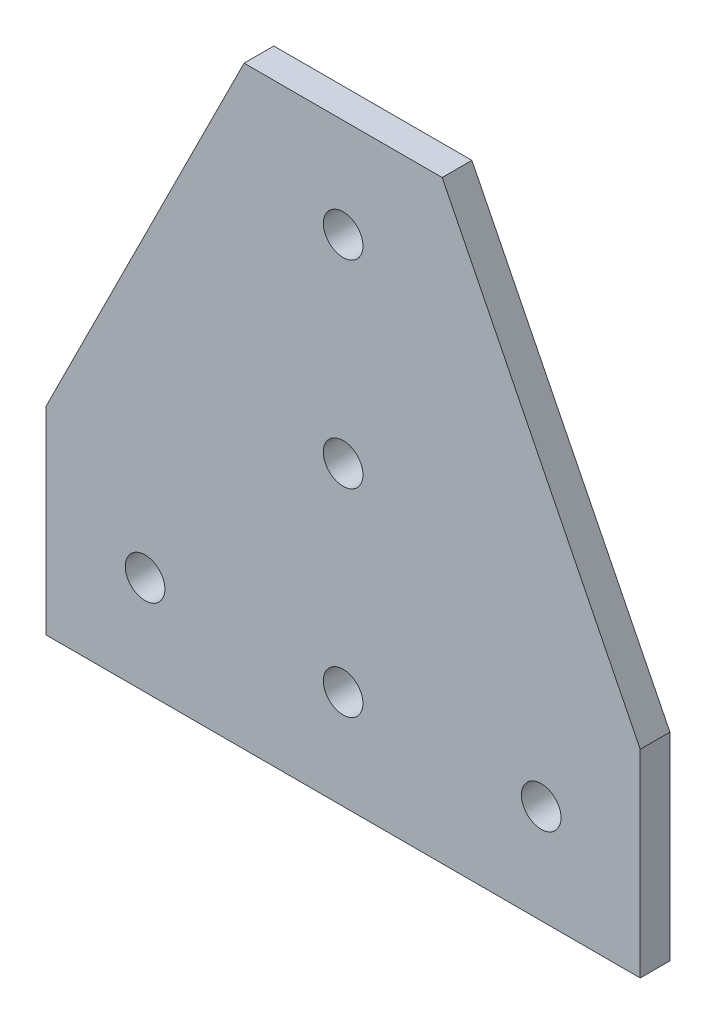
ISO-10303-21;
HEADER;
FILE_DESCRIPTION(('STEP AP214'),'2;1');
FILE_NAME('part.step','',(''),(''),'','','');
FILE_SCHEMA(('AUTOMOTIVE_DESIGN { 1 0 10303 214 1 1 1 1 }'));
ENDSEC;
DATA;
#1=APPLICATION_CONTEXT('core data for automotive mechanical design processes');
#2=APPLICATION_PROTOCOL_DEFINITION('international standard','automotive_design',2000,#1);
#3=PRODUCT_CONTEXT('',#1,'mechanical');
#4=PRODUCT('Part','Part','',(#3));
#5=PRODUCT_RELATED_PRODUCT_CATEGORY('part','',(#4));
#6=PRODUCT_DEFINITION_FORMATION('','',#4);
#7=PRODUCT_DEFINITION_CONTEXT('part definition',#1,'design');
#8=PRODUCT_DEFINITION('design','',#6,#7);
#9=PRODUCT_DEFINITION_SHAPE('','',#8);
#10=(LENGTH_UNIT() NAMED_UNIT(*) SI_UNIT(.MILLI.,.METRE.));
#11=(NAMED_UNIT(*) PLANE_ANGLE_UNIT() SI_UNIT($,.RADIAN.));
#12=(NAMED_UNIT(*) SI_UNIT($,.STERADIAN.) SOLID_ANGLE_UNIT());
#13=UNCERTAINTY_MEASURE_WITH_UNIT(LENGTH_MEASURE(1.E-05),#10,'distance_accuracy_value','');
#14=(GEOMETRIC_REPRESENTATION_CONTEXT(3) GLOBAL_UNCERTAINTY_ASSIGNED_CONTEXT((#13)) GLOBAL_UNIT_ASSIGNED_CONTEXT((#10,
#11,#12)) REPRESENTATION_CONTEXT('',''));
#15=CARTESIAN_POINT('',(0.,0.,0.));
#16=DIRECTION('',(0.,0.,1.));
#17=DIRECTION('',(1.,0.,0.));
#18=AXIS2_PLACEMENT_3D('',#15,#16,#17);
#19=CARTESIAN_POINT('',(0.,0.,3.));
#20=DIRECTION('',(0.,0.,1.));
#21=DIRECTION('',(1.,0.,0.));
#22=AXIS2_PLACEMENT_3D('',#19,#20,#21);
#23=PLANE('',#22);
#24=CARTESIAN_POINT('',(-34.3557518002468,-10.7418807523334,3.));
#25=DIRECTION('',(0.,0.,1.));
#26=DIRECTION('',(1.,0.,0.));
#27=AXIS2_PLACEMENT_3D('',#24,#25,#26);
#28=CIRCLE('',#27,2.00000000000002);
#29=CARTESIAN_POINT('',(-32.3557518002467,-10.7418807523334,3.));
#30=VERTEX_POINT('',#29);
#31=EDGE_CURVE('E222',#30,#30,#28,.T.);
#32=ORIENTED_EDGE('',*,*,#31,.F.);
#33=EDGE_LOOP('',(#32));
#34=FACE_BOUND('',#33,.T.);
#35=CARTESIAN_POINT('',(-34.3557518002468,-30.7418807523334,3.));
#36=DIRECTION('',(0.,0.,1.));
#37=DIRECTION('',(1.,0.,0.));
#38=AXIS2_PLACEMENT_3D('',#35,#36,#37);
#39=CIRCLE('',#38,2.);
#40=CARTESIAN_POINT('',(-32.3557518002468,-30.7418807523334,3.));
#41=VERTEX_POINT('',#40);
#42=EDGE_CURVE('E238',#41,#41,#39,.T.);
#43=ORIENTED_EDGE('',*,*,#42,.F.);
#44=EDGE_LOOP('',(#43));
#45=FACE_BOUND('',#44,.T.);
#46=DIRECTION('',(0.,-1.,0.));
#47=VECTOR('',#46,1.);
#48=CARTESIAN_POINT('',(-64.3557518002468,-20.7418807523334,3.));
#49=LINE('',#48,#47);
#50=CARTESIAN_POINT('',(-64.3557518002468,-20.7418807523334,3.));
#51=VERTEX_POINT('',#50);
#52=CARTESIAN_POINT('',(-64.3557518002468,-40.7418807523334,3.));
#53=VERTEX_POINT('',#52);
#54=EDGE_CURVE('E152',#51,#53,#49,.T.);
#55=ORIENTED_EDGE('',*,*,#54,.T.);
#56=DIRECTION('',(1.,0.,0.));
#57=VECTOR('',#56,1.);
#58=CARTESIAN_POINT('',(-64.3557518002468,-40.7418807523334,3.));
#59=LINE('',#58,#57);
#60=CARTESIAN_POINT('',(-4.35575180024675,-40.7418807523334,3.));
#61=VERTEX_POINT('',#60);
#62=EDGE_CURVE('E100',#53,#61,#59,.T.);
#63=ORIENTED_EDGE('',*,*,#62,.T.);
#64=DIRECTION('',(0.,1.,0.));
#65=VECTOR('',#64,1.);
#66=CARTESIAN_POINT('',(-4.35575180024675,-40.7418807523334,3.));
#67=LINE('',#66,#65);
#68=CARTESIAN_POINT('',(-4.35575180024675,-20.7418807523334,3.));
#69=VERTEX_POINT('',#68);
#70=EDGE_CURVE('E113',#61,#69,#67,.T.);
#71=ORIENTED_EDGE('',*,*,#70,.T.);
#72=DIRECTION('',(-0.447213595499957,0.894427190999916,0.));
#73=VECTOR('',#72,1.);
#74=CARTESIAN_POINT('',(-4.35575180024675,-20.7418807523334,3.));
#75=LINE('',#74,#73);
#76=CARTESIAN_POINT('',(-24.3557518002467,19.2581192476666,3.));
#77=VERTEX_POINT('',#76);
#78=EDGE_CURVE('E107',#69,#77,#75,.T.);
#79=ORIENTED_EDGE('',*,*,#78,.T.);
#80=DIRECTION('',(-1.,0.,0.));
#81=VECTOR('',#80,1.);
#82=CARTESIAN_POINT('',(-24.3557518002467,19.2581192476666,3.));
#83=LINE('',#82,#81);
#84=CARTESIAN_POINT('',(-44.3557518002468,19.2581192476666,3.));
#85=VERTEX_POINT('',#84);
#86=EDGE_CURVE('E111',#77,#85,#83,.T.);
#87=ORIENTED_EDGE('',*,*,#86,.T.);
#88=DIRECTION('',(-0.447213595499957,-0.894427190999916,0.));
#89=VECTOR('',#88,1.);
#90=CARTESIAN_POINT('',(-44.3557518002468,19.2581192476666,3.));
#91=LINE('',#90,#89);
#92=EDGE_CURVE('E63',#85,#51,#91,.T.);
#93=ORIENTED_EDGE('',*,*,#92,.T.);
#94=EDGE_LOOP('',(#55,#63,#71,#79,#87,#93));
#95=FACE_BOUND('',#94,.T.);
#96=CARTESIAN_POINT('',(-54.3557518002467,-30.7418807523334,3.));
#97=DIRECTION('',(0.,0.,1.));
#98=DIRECTION('',(1.,0.,0.));
#99=AXIS2_PLACEMENT_3D('',#96,#97,#98);
#100=CIRCLE('',#99,2.);
#101=CARTESIAN_POINT('',(-52.3557518002467,-30.7418807523334,3.));
#102=VERTEX_POINT('',#101);
#103=EDGE_CURVE('E140',#102,#102,#100,.T.);
#104=ORIENTED_EDGE('',*,*,#103,.F.);
#105=EDGE_LOOP('',(#104));
#106=FACE_BOUND('',#105,.T.);
#107=CARTESIAN_POINT('',(-14.3557518002468,-30.7418807523334,3.));
#108=DIRECTION('',(0.,0.,1.));
#109=DIRECTION('',(1.,0.,0.));
#110=AXIS2_PLACEMENT_3D('',#107,#108,#109);
#111=CIRCLE('',#110,1.99999999999997);
#112=CARTESIAN_POINT('',(-12.3557518002468,-30.7418807523334,3.));
#113=VERTEX_POINT('',#112);
#114=EDGE_CURVE('E230',#113,#113,#111,.T.);
#115=ORIENTED_EDGE('',*,*,#114,.F.);
#116=EDGE_LOOP('',(#115));
#117=FACE_BOUND('',#116,.T.);
#118=CARTESIAN_POINT('',(-34.3557518002468,9.25811924766662,3.));
#119=DIRECTION('',(0.,0.,1.));
#120=DIRECTION('',(1.,0.,0.));
#121=AXIS2_PLACEMENT_3D('',#118,#119,#120);
#122=CIRCLE('',#121,2.00000000000002);
#123=CARTESIAN_POINT('',(-32.3557518002467,9.25811924766662,3.));
#124=VERTEX_POINT('',#123);
#125=EDGE_CURVE('E211',#124,#124,#122,.T.);
#126=ORIENTED_EDGE('',*,*,#125,.F.);
#127=EDGE_LOOP('',(#126));
#128=FACE_BOUND('',#127,.T.);
#129=ADVANCED_FACE('F45',(#34,#45,#95,#106,#117,#128),#23,.T.);
#130=CARTESIAN_POINT('',(0.,0.,0.));
#131=DIRECTION('',(0.,0.,1.));
#132=DIRECTION('',(1.,0.,0.));
#133=AXIS2_PLACEMENT_3D('',#130,#131,#132);
#134=PLANE('',#133);
#135=DIRECTION('',(0.,-1.,0.));
#136=VECTOR('',#135,1.);
#137=CARTESIAN_POINT('',(-64.3557518002468,-20.7418807523334,0.));
#138=LINE('',#137,#136);
#139=CARTESIAN_POINT('',(-64.3557518002468,-20.7418807523334,0.));
#140=VERTEX_POINT('',#139);
#141=CARTESIAN_POINT('',(-64.3557518002468,-40.7418807523334,0.));
#142=VERTEX_POINT('',#141);
#143=EDGE_CURVE('E135',#140,#142,#138,.T.);
#144=ORIENTED_EDGE('',*,*,#143,.F.);
#145=DIRECTION('',(-0.447213595499957,-0.894427190999916,0.));
#146=VECTOR('',#145,1.);
#147=CARTESIAN_POINT('',(-44.3557518002468,19.2581192476666,0.));
#148=LINE('',#147,#146);
#149=CARTESIAN_POINT('',(-44.3557518002468,19.2581192476666,0.));
#150=VERTEX_POINT('',#149);
#151=EDGE_CURVE('E92',#150,#140,#148,.T.);
#152=ORIENTED_EDGE('',*,*,#151,.F.);
#153=DIRECTION('',(-1.,0.,0.));
#154=VECTOR('',#153,1.);
#155=CARTESIAN_POINT('',(-24.3557518002467,19.2581192476666,0.));
#156=LINE('',#155,#154);
#157=CARTESIAN_POINT('',(-24.3557518002467,19.2581192476666,0.));
#158=VERTEX_POINT('',#157);
#159=EDGE_CURVE('E86',#158,#150,#156,.T.);
#160=ORIENTED_EDGE('',*,*,#159,.F.);
#161=DIRECTION('',(-0.447213595499957,0.894427190999916,0.));
#162=VECTOR('',#161,1.);
#163=CARTESIAN_POINT('',(-4.35575180024675,-20.7418807523334,0.));
#164=LINE('',#163,#162);
#165=CARTESIAN_POINT('',(-4.35575180024675,-20.7418807523334,0.));
#166=VERTEX_POINT('',#165);
#167=EDGE_CURVE('E122',#166,#158,#164,.T.);
#168=ORIENTED_EDGE('',*,*,#167,.F.);
#169=DIRECTION('',(0.,1.,0.));
#170=VECTOR('',#169,1.);
#171=CARTESIAN_POINT('',(-4.35575180024675,-40.7418807523334,0.));
#172=LINE('',#171,#170);
#173=CARTESIAN_POINT('',(-4.35575180024675,-40.7418807523334,0.));
#174=VERTEX_POINT('',#173);
#175=EDGE_CURVE('E143',#174,#166,#172,.T.);
#176=ORIENTED_EDGE('',*,*,#175,.F.);
#177=DIRECTION('',(1.,0.,0.));
#178=VECTOR('',#177,1.);
#179=CARTESIAN_POINT('',(-64.3557518002468,-40.7418807523334,0.));
#180=LINE('',#179,#178);
#181=EDGE_CURVE('E139',#142,#174,#180,.T.);
#182=ORIENTED_EDGE('',*,*,#181,.F.);
#183=EDGE_LOOP('',(#144,#152,#160,#168,#176,#182));
#184=FACE_BOUND('',#183,.T.);
#185=CARTESIAN_POINT('',(-54.3557518002467,-30.7418807523334,0.));
#186=DIRECTION('',(0.,0.,1.));
#187=DIRECTION('',(1.,0.,0.));
#188=AXIS2_PLACEMENT_3D('',#185,#186,#187);
#189=CIRCLE('',#188,2.);
#190=CARTESIAN_POINT('',(-52.3557518002467,-30.7418807523334,0.));
#191=VERTEX_POINT('',#190);
#192=EDGE_CURVE('E242',#191,#191,#189,.T.);
#193=ORIENTED_EDGE('',*,*,#192,.T.);
#194=EDGE_LOOP('',(#193));
#195=FACE_BOUND('',#194,.T.);
#196=CARTESIAN_POINT('',(-34.3557518002468,-30.7418807523334,0.));
#197=DIRECTION('',(0.,0.,1.));
#198=DIRECTION('',(1.,0.,0.));
#199=AXIS2_PLACEMENT_3D('',#196,#197,#198);
#200=CIRCLE('',#199,2.);
#201=CARTESIAN_POINT('',(-32.3557518002468,-30.7418807523334,0.));
#202=VERTEX_POINT('',#201);
#203=EDGE_CURVE('E234',#202,#202,#200,.T.);
#204=ORIENTED_EDGE('',*,*,#203,.T.);
#205=EDGE_LOOP('',(#204));
#206=FACE_BOUND('',#205,.T.);
#207=CARTESIAN_POINT('',(-14.3557518002468,-30.7418807523334,0.));
#208=DIRECTION('',(0.,0.,1.));
#209=DIRECTION('',(1.,0.,0.));
#210=AXIS2_PLACEMENT_3D('',#207,#208,#209);
#211=CIRCLE('',#210,1.99999999999997);
#212=CARTESIAN_POINT('',(-12.3557518002468,-30.7418807523334,0.));
#213=VERTEX_POINT('',#212);
#214=EDGE_CURVE('E226',#213,#213,#211,.T.);
#215=ORIENTED_EDGE('',*,*,#214,.T.);
#216=EDGE_LOOP('',(#215));
#217=FACE_BOUND('',#216,.T.);
#218=CARTESIAN_POINT('',(-34.3557518002468,-10.7418807523334,0.));
#219=DIRECTION('',(0.,0.,1.));
#220=DIRECTION('',(1.,0.,0.));
#221=AXIS2_PLACEMENT_3D('',#218,#219,#220);
#222=CIRCLE('',#221,2.00000000000002);
#223=CARTESIAN_POINT('',(-32.3557518002467,-10.7418807523334,0.));
#224=VERTEX_POINT('',#223);
#225=EDGE_CURVE('E219',#224,#224,#222,.T.);
#226=ORIENTED_EDGE('',*,*,#225,.T.);
#227=EDGE_LOOP('',(#226));
#228=FACE_BOUND('',#227,.T.);
#229=CARTESIAN_POINT('',(-34.3557518002468,9.25811924766662,0.));
#230=DIRECTION('',(0.,0.,1.));
#231=DIRECTION('',(1.,0.,0.));
#232=AXIS2_PLACEMENT_3D('',#229,#230,#231);
#233=CIRCLE('',#232,2.00000000000002);
#234=CARTESIAN_POINT('',(-32.3557518002467,9.25811924766662,0.));
#235=VERTEX_POINT('',#234);
#236=EDGE_CURVE('E214',#235,#235,#233,.T.);
#237=ORIENTED_EDGE('',*,*,#236,.T.);
#238=EDGE_LOOP('',(#237));
#239=FACE_BOUND('',#238,.T.);
#240=ADVANCED_FACE('F165',(#184,#195,#206,#217,#228,#239),#134,.F.);
#241=CARTESIAN_POINT('',(-64.3557518002468,-20.7418807523334,3.));
#242=DIRECTION('',(1.,0.,0.));
#243=DIRECTION('',(0.,0.,-1.));
#244=AXIS2_PLACEMENT_3D('',#241,#242,#243);
#245=PLANE('',#244);
#246=ORIENTED_EDGE('',*,*,#143,.T.);
#247=DIRECTION('',(0.,0.,-1.));
#248=VECTOR('',#247,1.);
#249=CARTESIAN_POINT('',(-64.3557518002468,-40.7418807523334,3.));
#250=LINE('',#249,#248);
#251=EDGE_CURVE('E11',#53,#142,#250,.T.);
#252=ORIENTED_EDGE('',*,*,#251,.F.);
#253=ORIENTED_EDGE('',*,*,#54,.F.);
#254=DIRECTION('',(0.,0.,-1.));
#255=VECTOR('',#254,1.);
#256=CARTESIAN_POINT('',(-64.3557518002468,-20.7418807523334,3.));
#257=LINE('',#256,#255);
#258=EDGE_CURVE('E131',#51,#140,#257,.T.);
#259=ORIENTED_EDGE('',*,*,#258,.T.);
#260=EDGE_LOOP('',(#246,#252,#253,#259));
#261=FACE_BOUND('',#260,.T.);
#262=ADVANCED_FACE('F47',(#261),#245,.F.);
#263=CARTESIAN_POINT('',(-64.3557518002468,-40.7418807523334,3.));
#264=DIRECTION('',(0.,1.,0.));
#265=DIRECTION('',(0.,0.,1.));
#266=AXIS2_PLACEMENT_3D('',#263,#264,#265);
#267=PLANE('',#266);
#268=ORIENTED_EDGE('',*,*,#181,.T.);
#269=DIRECTION('',(0.,0.,-1.));
#270=VECTOR('',#269,1.);
#271=CARTESIAN_POINT('',(-4.35575180024675,-40.7418807523334,3.));
#272=LINE('',#271,#270);
#273=EDGE_CURVE('E55',#61,#174,#272,.T.);
#274=ORIENTED_EDGE('',*,*,#273,.F.);
#275=ORIENTED_EDGE('',*,*,#62,.F.);
#276=ORIENTED_EDGE('',*,*,#251,.T.);
#277=EDGE_LOOP('',(#268,#274,#275,#276));
#278=FACE_BOUND('',#277,.T.);
#279=ADVANCED_FACE('F320',(#278),#267,.F.);
#280=CARTESIAN_POINT('',(-4.35575180024675,-40.7418807523334,3.));
#281=DIRECTION('',(-1.,0.,0.));
#282=DIRECTION('',(0.,0.,1.));
#283=AXIS2_PLACEMENT_3D('',#280,#281,#282);
#284=PLANE('',#283);
#285=ORIENTED_EDGE('',*,*,#175,.T.);
#286=DIRECTION('',(0.,0.,-1.));
#287=VECTOR('',#286,1.);
#288=CARTESIAN_POINT('',(-4.35575180024675,-20.7418807523334,3.));
#289=LINE('',#288,#287);
#290=EDGE_CURVE('E124',#69,#166,#289,.T.);
#291=ORIENTED_EDGE('',*,*,#290,.F.);
#292=ORIENTED_EDGE('',*,*,#70,.F.);
#293=ORIENTED_EDGE('',*,*,#273,.T.);
#294=EDGE_LOOP('',(#285,#291,#292,#293));
#295=FACE_BOUND('',#294,.T.);
#296=ADVANCED_FACE('F162',(#295),#284,.F.);
#297=CARTESIAN_POINT('',(-4.35575180024675,-20.7418807523334,3.));
#298=DIRECTION('',(-0.894427190999916,-0.447213595499957,0.));
#299=DIRECTION('',(0.447213595499957,-0.894427190999916,0.));
#300=AXIS2_PLACEMENT_3D('',#297,#298,#299);
#301=PLANE('',#300);
#302=ORIENTED_EDGE('',*,*,#167,.T.);
#303=DIRECTION('',(0.,0.,-1.));
#304=VECTOR('',#303,1.);
#305=CARTESIAN_POINT('',(-24.3557518002467,19.2581192476666,3.));
#306=LINE('',#305,#304);
#307=EDGE_CURVE('E119',#77,#158,#306,.T.);
#308=ORIENTED_EDGE('',*,*,#307,.F.);
#309=ORIENTED_EDGE('',*,*,#78,.F.);
#310=ORIENTED_EDGE('',*,*,#290,.T.);
#311=EDGE_LOOP('',(#302,#308,#309,#310));
#312=FACE_BOUND('',#311,.T.);
#313=ADVANCED_FACE('F120',(#312),#301,.F.);
#314=CARTESIAN_POINT('',(-24.3557518002467,19.2581192476666,3.));
#315=DIRECTION('',(0.,-1.,0.));
#316=DIRECTION('',(0.,0.,-1.));
#317=AXIS2_PLACEMENT_3D('',#314,#315,#316);
#318=PLANE('',#317);
#319=ORIENTED_EDGE('',*,*,#159,.T.);
#320=DIRECTION('',(0.,0.,-1.));
#321=VECTOR('',#320,1.);
#322=CARTESIAN_POINT('',(-44.3557518002468,19.2581192476666,3.));
#323=LINE('',#322,#321);
#324=EDGE_CURVE('E125',#85,#150,#323,.T.);
#325=ORIENTED_EDGE('',*,*,#324,.F.);
#326=ORIENTED_EDGE('',*,*,#86,.F.);
#327=ORIENTED_EDGE('',*,*,#307,.T.);
#328=EDGE_LOOP('',(#319,#325,#326,#327));
#329=FACE_BOUND('',#328,.T.);
#330=ADVANCED_FACE('F127',(#329),#318,.F.);
#331=CARTESIAN_POINT('',(-44.3557518002468,19.2581192476666,3.));
#332=DIRECTION('',(0.894427190999916,-0.447213595499957,0.));
#333=DIRECTION('',(0.447213595499957,0.894427190999916,0.));
#334=AXIS2_PLACEMENT_3D('',#331,#332,#333);
#335=PLANE('',#334);
#336=ORIENTED_EDGE('',*,*,#151,.T.);
#337=ORIENTED_EDGE('',*,*,#258,.F.);
#338=ORIENTED_EDGE('',*,*,#92,.F.);
#339=ORIENTED_EDGE('',*,*,#324,.T.);
#340=EDGE_LOOP('',(#336,#337,#338,#339));
#341=FACE_BOUND('',#340,.T.);
#342=ADVANCED_FACE('F170',(#341),#335,.F.);
#343=CARTESIAN_POINT('',(-54.3557518002467,-30.7418807523334,3.));
#344=DIRECTION('',(0.,0.,-1.));
#345=DIRECTION('',(-1.,0.,0.));
#346=AXIS2_PLACEMENT_3D('',#343,#344,#345);
#347=CYLINDRICAL_SURFACE('',#346,2.);
#348=ORIENTED_EDGE('',*,*,#103,.T.);
#349=EDGE_LOOP('',(#348));
#350=FACE_BOUND('',#349,.T.);
#351=ORIENTED_EDGE('',*,*,#192,.F.);
#352=EDGE_LOOP('',(#351));
#353=FACE_BOUND('',#352,.T.);
#354=ADVANCED_FACE('F172',(#350,#353),#347,.F.);
#355=CARTESIAN_POINT('',(-34.3557518002468,-30.7418807523334,3.));
#356=DIRECTION('',(0.,0.,-1.));
#357=DIRECTION('',(-1.,0.,0.));
#358=AXIS2_PLACEMENT_3D('',#355,#356,#357);
#359=CYLINDRICAL_SURFACE('',#358,2.);
#360=ORIENTED_EDGE('',*,*,#42,.T.);
#361=EDGE_LOOP('',(#360));
#362=FACE_BOUND('',#361,.T.);
#363=ORIENTED_EDGE('',*,*,#203,.F.);
#364=EDGE_LOOP('',(#363));
#365=FACE_BOUND('',#364,.T.);
#366=ADVANCED_FACE('F178',(#362,#365),#359,.F.);
#367=CARTESIAN_POINT('',(-14.3557518002468,-30.7418807523334,3.));
#368=DIRECTION('',(0.,0.,-1.));
#369=DIRECTION('',(-1.,0.,0.));
#370=AXIS2_PLACEMENT_3D('',#367,#368,#369);
#371=CYLINDRICAL_SURFACE('',#370,1.99999999999997);
#372=ORIENTED_EDGE('',*,*,#114,.T.);
#373=EDGE_LOOP('',(#372));
#374=FACE_BOUND('',#373,.T.);
#375=ORIENTED_EDGE('',*,*,#214,.F.);
#376=EDGE_LOOP('',(#375));
#377=FACE_BOUND('',#376,.T.);
#378=ADVANCED_FACE('F194',(#374,#377),#371,.F.);
#379=CARTESIAN_POINT('',(-34.3557518002468,-10.7418807523334,3.));
#380=DIRECTION('',(0.,0.,-1.));
#381=DIRECTION('',(-1.,0.,0.));
#382=AXIS2_PLACEMENT_3D('',#379,#380,#381);
#383=CYLINDRICAL_SURFACE('',#382,2.00000000000002);
#384=ORIENTED_EDGE('',*,*,#31,.T.);
#385=EDGE_LOOP('',(#384));
#386=FACE_BOUND('',#385,.T.);
#387=ORIENTED_EDGE('',*,*,#225,.F.);
#388=EDGE_LOOP('',(#387));
#389=FACE_BOUND('',#388,.T.);
#390=ADVANCED_FACE('F198',(#386,#389),#383,.F.);
#391=CARTESIAN_POINT('',(-34.3557518002468,9.25811924766662,3.));
#392=DIRECTION('',(0.,0.,-1.));
#393=DIRECTION('',(-1.,0.,0.));
#394=AXIS2_PLACEMENT_3D('',#391,#392,#393);
#395=CYLINDRICAL_SURFACE('',#394,2.00000000000002);
#396=ORIENTED_EDGE('',*,*,#125,.T.);
#397=EDGE_LOOP('',(#396));
#398=FACE_BOUND('',#397,.T.);
#399=ORIENTED_EDGE('',*,*,#236,.F.);
#400=EDGE_LOOP('',(#399));
#401=FACE_BOUND('',#400,.T.);
#402=ADVANCED_FACE('F202',(#398,#401),#395,.F.);
#403=CLOSED_SHELL('',(#129,#240,#262,#279,#296,#313,#330,#342,#354,#366,#378,#390,#402));
#404=MANIFOLD_SOLID_BREP('B2',#403);
#405=ADVANCED_BREP_SHAPE_REPRESENTATION('',(#18,#404),#14);
#406=SHAPE_DEFINITION_REPRESENTATION(#9,#405);
ENDSEC;
END-ISO-10303-21;
